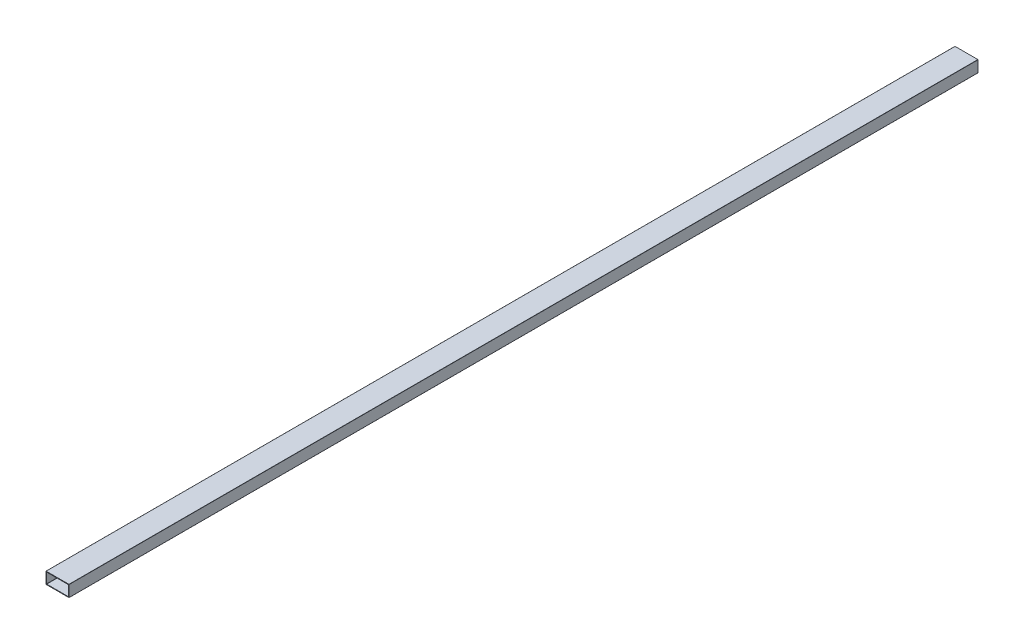
ISO-10303-21;
HEADER;
FILE_DESCRIPTION(('STEP AP214'),'2;1');
FILE_NAME('part.step','',(''),(''),'','','');
FILE_SCHEMA(('AUTOMOTIVE_DESIGN { 1 0 10303 214 1 1 1 1 }'));
ENDSEC;
DATA;
#1=APPLICATION_CONTEXT('core data for automotive mechanical design processes');
#2=APPLICATION_PROTOCOL_DEFINITION('international standard','automotive_design',2000,#1);
#3=PRODUCT_CONTEXT('',#1,'mechanical');
#4=PRODUCT('Part','Part','',(#3));
#5=PRODUCT_RELATED_PRODUCT_CATEGORY('part','',(#4));
#6=PRODUCT_DEFINITION_FORMATION('','',#4);
#7=PRODUCT_DEFINITION_CONTEXT('part definition',#1,'design');
#8=PRODUCT_DEFINITION('design','',#6,#7);
#9=PRODUCT_DEFINITION_SHAPE('','',#8);
#10=(LENGTH_UNIT() NAMED_UNIT(*) SI_UNIT(.MILLI.,.METRE.));
#11=(NAMED_UNIT(*) PLANE_ANGLE_UNIT() SI_UNIT($,.RADIAN.));
#12=(NAMED_UNIT(*) SI_UNIT($,.STERADIAN.) SOLID_ANGLE_UNIT());
#13=UNCERTAINTY_MEASURE_WITH_UNIT(LENGTH_MEASURE(1.E-05),#10,'distance_accuracy_value','');
#14=(GEOMETRIC_REPRESENTATION_CONTEXT(3) GLOBAL_UNCERTAINTY_ASSIGNED_CONTEXT((#13)) GLOBAL_UNIT_ASSIGNED_CONTEXT((#10,
#11,#12)) REPRESENTATION_CONTEXT('',''));
#15=CARTESIAN_POINT('',(0.,0.,0.));
#16=DIRECTION('',(0.,0.,1.));
#17=DIRECTION('',(1.,0.,0.));
#18=AXIS2_PLACEMENT_3D('',#15,#16,#17);
#19=CARTESIAN_POINT('',(76.2,-38.1,-6000.));
#20=DIRECTION('',(1.,0.,0.));
#21=DIRECTION('',(0.,0.,-1.));
#22=AXIS2_PLACEMENT_3D('',#19,#20,#21);
#23=PLANE('',#22);
#24=DIRECTION('',(0.,1.,0.));
#25=VECTOR('',#24,1.);
#26=CARTESIAN_POINT('',(76.2,-38.1,0.));
#27=LINE('',#26,#25);
#28=CARTESIAN_POINT('',(76.2,-37.1,0.));
#29=VERTEX_POINT('',#28);
#30=CARTESIAN_POINT('',(76.2,37.1,0.));
#31=VERTEX_POINT('',#30);
#32=EDGE_CURVE('E197',#29,#31,#27,.T.);
#33=ORIENTED_EDGE('',*,*,#32,.F.);
#34=DIRECTION('',(0.,0.,1.));
#35=VECTOR('',#34,1.);
#36=CARTESIAN_POINT('',(76.2,-37.1,-6000.));
#37=LINE('',#36,#35);
#38=CARTESIAN_POINT('',(76.2,-37.1,-6000.));
#39=VERTEX_POINT('',#38);
#40=EDGE_CURVE('E158',#29,#39,#37,.F.);
#41=ORIENTED_EDGE('',*,*,#40,.T.);
#42=DIRECTION('',(0.,1.,0.));
#43=VECTOR('',#42,1.);
#44=CARTESIAN_POINT('',(76.2,-38.1,-6000.));
#45=LINE('',#44,#43);
#46=CARTESIAN_POINT('',(76.2,37.1,-6000.));
#47=VERTEX_POINT('',#46);
#48=EDGE_CURVE('E185',#39,#47,#45,.T.);
#49=ORIENTED_EDGE('',*,*,#48,.T.);
#50=DIRECTION('',(0.,0.,1.));
#51=VECTOR('',#50,1.);
#52=CARTESIAN_POINT('',(76.2,37.1,-6000.));
#53=LINE('',#52,#51);
#54=EDGE_CURVE('E251',#47,#31,#53,.T.);
#55=ORIENTED_EDGE('',*,*,#54,.T.);
#56=EDGE_LOOP('',(#33,#41,#49,#55));
#57=FACE_BOUND('',#56,.T.);
#58=ADVANCED_FACE('F33',(#57),#23,.T.);
#59=CARTESIAN_POINT('',(-76.2,-38.1,-6000.));
#60=DIRECTION('',(0.,-1.,0.));
#61=DIRECTION('',(0.,0.,-1.));
#62=AXIS2_PLACEMENT_3D('',#59,#60,#61);
#63=PLANE('',#62);
#64=DIRECTION('',(1.,0.,0.));
#65=VECTOR('',#64,1.);
#66=CARTESIAN_POINT('',(-76.2,-38.1,0.));
#67=LINE('',#66,#65);
#68=CARTESIAN_POINT('',(-75.2,-38.1,0.));
#69=VERTEX_POINT('',#68);
#70=CARTESIAN_POINT('',(75.1999999999999,-38.1,0.));
#71=VERTEX_POINT('',#70);
#72=EDGE_CURVE('E189',#69,#71,#67,.T.);
#73=ORIENTED_EDGE('',*,*,#72,.F.);
#74=DIRECTION('',(0.,0.,1.));
#75=VECTOR('',#74,1.);
#76=CARTESIAN_POINT('',(-75.2,-38.1,-6000.));
#77=LINE('',#76,#75);
#78=CARTESIAN_POINT('',(-75.2,-38.1,-6000.));
#79=VERTEX_POINT('',#78);
#80=EDGE_CURVE('E238',#69,#79,#77,.F.);
#81=ORIENTED_EDGE('',*,*,#80,.T.);
#82=DIRECTION('',(1.,0.,0.));
#83=VECTOR('',#82,1.);
#84=CARTESIAN_POINT('',(-76.2,-38.1,-6000.));
#85=LINE('',#84,#83);
#86=CARTESIAN_POINT('',(75.1999999999999,-38.1,-6000.));
#87=VERTEX_POINT('',#86);
#88=EDGE_CURVE('E194',#79,#87,#85,.T.);
#89=ORIENTED_EDGE('',*,*,#88,.T.);
#90=DIRECTION('',(0.,0.,1.));
#91=VECTOR('',#90,1.);
#92=CARTESIAN_POINT('',(75.2,-38.1,-6000.));
#93=LINE('',#92,#91);
#94=EDGE_CURVE('E235',#87,#71,#93,.T.);
#95=ORIENTED_EDGE('',*,*,#94,.T.);
#96=EDGE_LOOP('',(#73,#81,#89,#95));
#97=FACE_BOUND('',#96,.T.);
#98=ADVANCED_FACE('F305',(#97),#63,.T.);
#99=CARTESIAN_POINT('',(-76.2,-38.1,-6000.));
#100=DIRECTION('',(-1.,0.,0.));
#101=DIRECTION('',(0.,0.,1.));
#102=AXIS2_PLACEMENT_3D('',#99,#100,#101);
#103=PLANE('',#102);
#104=DIRECTION('',(0.,-1.,0.));
#105=VECTOR('',#104,1.);
#106=CARTESIAN_POINT('',(-76.2,-38.1,-6000.));
#107=LINE('',#106,#105);
#108=CARTESIAN_POINT('',(-76.2,37.1,-6000.));
#109=VERTEX_POINT('',#108);
#110=CARTESIAN_POINT('',(-76.2,-37.1,-6000.));
#111=VERTEX_POINT('',#110);
#112=EDGE_CURVE('E191',#109,#111,#107,.T.);
#113=ORIENTED_EDGE('',*,*,#112,.T.);
#114=DIRECTION('',(0.,0.,1.));
#115=VECTOR('',#114,1.);
#116=CARTESIAN_POINT('',(-76.2,-37.1,-6000.));
#117=LINE('',#116,#115);
#118=CARTESIAN_POINT('',(-76.2,-37.1,0.));
#119=VERTEX_POINT('',#118);
#120=EDGE_CURVE('E224',#111,#119,#117,.T.);
#121=ORIENTED_EDGE('',*,*,#120,.T.);
#122=DIRECTION('',(0.,-1.,0.));
#123=VECTOR('',#122,1.);
#124=CARTESIAN_POINT('',(-76.2,-38.1,0.));
#125=LINE('',#124,#123);
#126=CARTESIAN_POINT('',(-76.2,37.1,0.));
#127=VERTEX_POINT('',#126);
#128=EDGE_CURVE('E203',#127,#119,#125,.T.);
#129=ORIENTED_EDGE('',*,*,#128,.F.);
#130=DIRECTION('',(0.,0.,1.));
#131=VECTOR('',#130,1.);
#132=CARTESIAN_POINT('',(-76.2,37.1,-6000.));
#133=LINE('',#132,#131);
#134=EDGE_CURVE('E222',#127,#109,#133,.F.);
#135=ORIENTED_EDGE('',*,*,#134,.T.);
#136=EDGE_LOOP('',(#113,#121,#129,#135));
#137=FACE_BOUND('',#136,.T.);
#138=ADVANCED_FACE('F311',(#137),#103,.T.);
#139=CARTESIAN_POINT('',(-76.2,38.1,-6000.));
#140=DIRECTION('',(0.,1.,0.));
#141=DIRECTION('',(0.,0.,1.));
#142=AXIS2_PLACEMENT_3D('',#139,#140,#141);
#143=PLANE('',#142);
#144=DIRECTION('',(-1.,0.,0.));
#145=VECTOR('',#144,1.);
#146=CARTESIAN_POINT('',(-76.2,38.1,-6000.));
#147=LINE('',#146,#145);
#148=CARTESIAN_POINT('',(75.1999999999999,38.1,-6000.));
#149=VERTEX_POINT('',#148);
#150=CARTESIAN_POINT('',(-75.2,38.1,-6000.));
#151=VERTEX_POINT('',#150);
#152=EDGE_CURVE('E188',#149,#151,#147,.T.);
#153=ORIENTED_EDGE('',*,*,#152,.T.);
#154=DIRECTION('',(0.,0.,1.));
#155=VECTOR('',#154,1.);
#156=CARTESIAN_POINT('',(-75.2,38.1,-6000.));
#157=LINE('',#156,#155);
#158=CARTESIAN_POINT('',(-75.2,38.1,0.));
#159=VERTEX_POINT('',#158);
#160=EDGE_CURVE('E248',#151,#159,#157,.T.);
#161=ORIENTED_EDGE('',*,*,#160,.T.);
#162=DIRECTION('',(-1.,0.,0.));
#163=VECTOR('',#162,1.);
#164=CARTESIAN_POINT('',(-76.2,38.1,0.));
#165=LINE('',#164,#163);
#166=CARTESIAN_POINT('',(75.1999999999999,38.1,0.));
#167=VERTEX_POINT('',#166);
#168=EDGE_CURVE('E200',#167,#159,#165,.T.);
#169=ORIENTED_EDGE('',*,*,#168,.F.);
#170=DIRECTION('',(0.,0.,1.));
#171=VECTOR('',#170,1.);
#172=CARTESIAN_POINT('',(75.2,38.1,-6000.));
#173=LINE('',#172,#171);
#174=EDGE_CURVE('E55',#167,#149,#173,.F.);
#175=ORIENTED_EDGE('',*,*,#174,.T.);
#176=EDGE_LOOP('',(#153,#161,#169,#175));
#177=FACE_BOUND('',#176,.T.);
#178=ADVANCED_FACE('F316',(#177),#143,.T.);
#179=CARTESIAN_POINT('',(0.,0.,-6000.));
#180=DIRECTION('',(0.,0.,-1.));
#181=DIRECTION('',(-1.,0.,0.));
#182=AXIS2_PLACEMENT_3D('',#179,#180,#181);
#183=PLANE('',#182);
#184=DIRECTION('',(0.,-1.,0.));
#185=VECTOR('',#184,1.);
#186=CARTESIAN_POINT('',(-72.4,-34.3,-6000.));
#187=LINE('',#186,#185);
#188=CARTESIAN_POINT('',(-72.4,33.3,-6000.));
#189=VERTEX_POINT('',#188);
#190=CARTESIAN_POINT('',(-72.4,-33.3,-6000.));
#191=VERTEX_POINT('',#190);
#192=EDGE_CURVE('E167',#189,#191,#187,.T.);
#193=ORIENTED_EDGE('',*,*,#192,.T.);
#194=CARTESIAN_POINT('',(-71.4,-33.3,-6000.));
#195=DIRECTION('',(0.,0.,-1.));
#196=DIRECTION('',(-1.,0.,0.));
#197=AXIS2_PLACEMENT_3D('',#194,#195,#196);
#198=CIRCLE('',#197,1.);
#199=CARTESIAN_POINT('',(-71.4,-34.3,-6000.));
#200=VERTEX_POINT('',#199);
#201=EDGE_CURVE('E11',#191,#200,#198,.F.);
#202=ORIENTED_EDGE('',*,*,#201,.T.);
#203=DIRECTION('',(1.,0.,0.));
#204=VECTOR('',#203,1.);
#205=CARTESIAN_POINT('',(-72.4,-34.3,-6000.));
#206=LINE('',#205,#204);
#207=CARTESIAN_POINT('',(71.3999999999999,-34.3,-6000.));
#208=VERTEX_POINT('',#207);
#209=EDGE_CURVE('E175',#200,#208,#206,.T.);
#210=ORIENTED_EDGE('',*,*,#209,.T.);
#211=CARTESIAN_POINT('',(71.4,-33.3,-6000.));
#212=DIRECTION('',(0.,0.,-1.));
#213=DIRECTION('',(-1.,0.,0.));
#214=AXIS2_PLACEMENT_3D('',#211,#212,#213);
#215=CIRCLE('',#214,1.);
#216=CARTESIAN_POINT('',(72.4,-33.3,-6000.));
#217=VERTEX_POINT('',#216);
#218=EDGE_CURVE('E262',#208,#217,#215,.F.);
#219=ORIENTED_EDGE('',*,*,#218,.T.);
#220=DIRECTION('',(0.,1.,0.));
#221=VECTOR('',#220,1.);
#222=CARTESIAN_POINT('',(72.4,-34.3,-6000.));
#223=LINE('',#222,#221);
#224=CARTESIAN_POINT('',(72.4,33.3,-6000.));
#225=VERTEX_POINT('',#224);
#226=EDGE_CURVE('E179',#217,#225,#223,.T.);
#227=ORIENTED_EDGE('',*,*,#226,.T.);
#228=CARTESIAN_POINT('',(71.4,33.3,-6000.));
#229=DIRECTION('',(0.,0.,-1.));
#230=DIRECTION('',(-1.,0.,0.));
#231=AXIS2_PLACEMENT_3D('',#228,#229,#230);
#232=CIRCLE('',#231,1.);
#233=CARTESIAN_POINT('',(71.3999999999999,34.3,-6000.));
#234=VERTEX_POINT('',#233);
#235=EDGE_CURVE('E258',#225,#234,#232,.F.);
#236=ORIENTED_EDGE('',*,*,#235,.T.);
#237=DIRECTION('',(-1.,0.,0.));
#238=VECTOR('',#237,1.);
#239=CARTESIAN_POINT('',(-72.4,34.3,-6000.));
#240=LINE('',#239,#238);
#241=CARTESIAN_POINT('',(-71.4,34.3,-6000.));
#242=VERTEX_POINT('',#241);
#243=EDGE_CURVE('E277',#234,#242,#240,.T.);
#244=ORIENTED_EDGE('',*,*,#243,.T.);
#245=CARTESIAN_POINT('',(-71.4,33.3,-6000.));
#246=DIRECTION('',(0.,0.,-1.));
#247=DIRECTION('',(-1.,0.,0.));
#248=AXIS2_PLACEMENT_3D('',#245,#246,#247);
#249=CIRCLE('',#248,1.);
#250=EDGE_CURVE('E157',#242,#189,#249,.F.);
#251=ORIENTED_EDGE('',*,*,#250,.T.);
#252=EDGE_LOOP('',(#193,#202,#210,#219,#227,#236,#244,#251));
#253=FACE_BOUND('',#252,.T.);
#254=ORIENTED_EDGE('',*,*,#88,.F.);
#255=CARTESIAN_POINT('',(-75.2,-37.1,-6000.));
#256=DIRECTION('',(0.,0.,-1.));
#257=DIRECTION('',(-1.,0.,0.));
#258=AXIS2_PLACEMENT_3D('',#255,#256,#257);
#259=CIRCLE('',#258,1.);
#260=EDGE_CURVE('E245',#79,#111,#259,.T.);
#261=ORIENTED_EDGE('',*,*,#260,.T.);
#262=ORIENTED_EDGE('',*,*,#112,.F.);
#263=CARTESIAN_POINT('',(-75.2,37.1,-6000.));
#264=DIRECTION('',(0.,0.,-1.));
#265=DIRECTION('',(-1.,0.,0.));
#266=AXIS2_PLACEMENT_3D('',#263,#264,#265);
#267=CIRCLE('',#266,1.);
#268=EDGE_CURVE('E48',#109,#151,#267,.T.);
#269=ORIENTED_EDGE('',*,*,#268,.T.);
#270=ORIENTED_EDGE('',*,*,#152,.F.);
#271=CARTESIAN_POINT('',(75.2,37.1,-6000.));
#272=DIRECTION('',(0.,0.,-1.));
#273=DIRECTION('',(-1.,0.,0.));
#274=AXIS2_PLACEMENT_3D('',#271,#272,#273);
#275=CIRCLE('',#274,1.);
#276=EDGE_CURVE('E240',#149,#47,#275,.T.);
#277=ORIENTED_EDGE('',*,*,#276,.T.);
#278=ORIENTED_EDGE('',*,*,#48,.F.);
#279=CARTESIAN_POINT('',(75.2,-37.1,-6000.));
#280=DIRECTION('',(0.,0.,-1.));
#281=DIRECTION('',(-1.,0.,0.));
#282=AXIS2_PLACEMENT_3D('',#279,#280,#281);
#283=CIRCLE('',#282,1.);
#284=EDGE_CURVE('E242',#39,#87,#283,.T.);
#285=ORIENTED_EDGE('',*,*,#284,.T.);
#286=EDGE_LOOP('',(#254,#261,#262,#269,#270,#277,#278,#285));
#287=FACE_BOUND('',#286,.T.);
#288=ADVANCED_FACE('F267',(#253,#287),#183,.T.);
#289=CARTESIAN_POINT('',(0.,0.,0.));
#290=DIRECTION('',(0.,0.,-1.));
#291=DIRECTION('',(-1.,0.,0.));
#292=AXIS2_PLACEMENT_3D('',#289,#290,#291);
#293=PLANE('',#292);
#294=DIRECTION('',(0.,1.,0.));
#295=VECTOR('',#294,1.);
#296=CARTESIAN_POINT('',(72.4,-34.3,0.));
#297=LINE('',#296,#295);
#298=CARTESIAN_POINT('',(72.4,-33.3,0.));
#299=VERTEX_POINT('',#298);
#300=CARTESIAN_POINT('',(72.4,33.3,0.));
#301=VERTEX_POINT('',#300);
#302=EDGE_CURVE('E181',#299,#301,#297,.T.);
#303=ORIENTED_EDGE('',*,*,#302,.F.);
#304=CARTESIAN_POINT('',(71.4,-33.3,0.));
#305=DIRECTION('',(0.,0.,-1.));
#306=DIRECTION('',(-1.,0.,0.));
#307=AXIS2_PLACEMENT_3D('',#304,#305,#306);
#308=CIRCLE('',#307,1.);
#309=CARTESIAN_POINT('',(71.3999999999999,-34.3,0.));
#310=VERTEX_POINT('',#309);
#311=EDGE_CURVE('E260',#299,#310,#308,.T.);
#312=ORIENTED_EDGE('',*,*,#311,.T.);
#313=DIRECTION('',(1.,0.,0.));
#314=VECTOR('',#313,1.);
#315=CARTESIAN_POINT('',(-72.4,-34.3,0.));
#316=LINE('',#315,#314);
#317=CARTESIAN_POINT('',(-71.4,-34.3,0.));
#318=VERTEX_POINT('',#317);
#319=EDGE_CURVE('E281',#318,#310,#316,.T.);
#320=ORIENTED_EDGE('',*,*,#319,.F.);
#321=CARTESIAN_POINT('',(-71.4,-33.3,0.));
#322=DIRECTION('',(0.,0.,-1.));
#323=DIRECTION('',(-1.,0.,0.));
#324=AXIS2_PLACEMENT_3D('',#321,#322,#323);
#325=CIRCLE('',#324,1.);
#326=CARTESIAN_POINT('',(-72.4,-33.3,0.));
#327=VERTEX_POINT('',#326);
#328=EDGE_CURVE('E41',#318,#327,#325,.T.);
#329=ORIENTED_EDGE('',*,*,#328,.T.);
#330=DIRECTION('',(0.,-1.,0.));
#331=VECTOR('',#330,1.);
#332=CARTESIAN_POINT('',(-72.4,-34.3,0.));
#333=LINE('',#332,#331);
#334=CARTESIAN_POINT('',(-72.4,33.3,0.));
#335=VERTEX_POINT('',#334);
#336=EDGE_CURVE('E164',#335,#327,#333,.T.);
#337=ORIENTED_EDGE('',*,*,#336,.F.);
#338=CARTESIAN_POINT('',(-71.4,33.3,0.));
#339=DIRECTION('',(0.,0.,-1.));
#340=DIRECTION('',(-1.,0.,0.));
#341=AXIS2_PLACEMENT_3D('',#338,#339,#340);
#342=CIRCLE('',#341,1.);
#343=CARTESIAN_POINT('',(-71.4,34.3,0.));
#344=VERTEX_POINT('',#343);
#345=EDGE_CURVE('E147',#335,#344,#342,.T.);
#346=ORIENTED_EDGE('',*,*,#345,.T.);
#347=DIRECTION('',(-1.,0.,0.));
#348=VECTOR('',#347,1.);
#349=CARTESIAN_POINT('',(-72.4,34.3,0.));
#350=LINE('',#349,#348);
#351=CARTESIAN_POINT('',(71.3999999999999,34.3,0.));
#352=VERTEX_POINT('',#351);
#353=EDGE_CURVE('E176',#352,#344,#350,.T.);
#354=ORIENTED_EDGE('',*,*,#353,.F.);
#355=CARTESIAN_POINT('',(71.4,33.3,0.));
#356=DIRECTION('',(0.,0.,-1.));
#357=DIRECTION('',(-1.,0.,0.));
#358=AXIS2_PLACEMENT_3D('',#355,#356,#357);
#359=CIRCLE('',#358,1.);
#360=EDGE_CURVE('E256',#352,#301,#359,.T.);
#361=ORIENTED_EDGE('',*,*,#360,.T.);
#362=EDGE_LOOP('',(#303,#312,#320,#329,#337,#346,#354,#361));
#363=FACE_BOUND('',#362,.T.);
#364=ORIENTED_EDGE('',*,*,#128,.T.);
#365=CARTESIAN_POINT('',(-75.2,-37.1,0.));
#366=DIRECTION('',(0.,0.,-1.));
#367=DIRECTION('',(-1.,0.,0.));
#368=AXIS2_PLACEMENT_3D('',#365,#366,#367);
#369=CIRCLE('',#368,1.);
#370=EDGE_CURVE('E233',#119,#69,#369,.F.);
#371=ORIENTED_EDGE('',*,*,#370,.T.);
#372=ORIENTED_EDGE('',*,*,#72,.T.);
#373=CARTESIAN_POINT('',(75.2,-37.1,0.));
#374=DIRECTION('',(0.,0.,-1.));
#375=DIRECTION('',(-1.,0.,0.));
#376=AXIS2_PLACEMENT_3D('',#373,#374,#375);
#377=CIRCLE('',#376,1.);
#378=EDGE_CURVE('E229',#71,#29,#377,.F.);
#379=ORIENTED_EDGE('',*,*,#378,.T.);
#380=ORIENTED_EDGE('',*,*,#32,.T.);
#381=CARTESIAN_POINT('',(75.2,37.1,0.));
#382=DIRECTION('',(0.,0.,-1.));
#383=DIRECTION('',(-1.,0.,0.));
#384=AXIS2_PLACEMENT_3D('',#381,#382,#383);
#385=CIRCLE('',#384,1.);
#386=EDGE_CURVE('E227',#31,#167,#385,.F.);
#387=ORIENTED_EDGE('',*,*,#386,.T.);
#388=ORIENTED_EDGE('',*,*,#168,.T.);
#389=CARTESIAN_POINT('',(-75.2,37.1,0.));
#390=DIRECTION('',(0.,0.,-1.));
#391=DIRECTION('',(-1.,0.,0.));
#392=AXIS2_PLACEMENT_3D('',#389,#390,#391);
#393=CIRCLE('',#392,1.);
#394=EDGE_CURVE('E231',#159,#127,#393,.F.);
#395=ORIENTED_EDGE('',*,*,#394,.T.);
#396=EDGE_LOOP('',(#364,#371,#372,#379,#380,#387,#388,#395));
#397=FACE_BOUND('',#396,.T.);
#398=ADVANCED_FACE('F172',(#363,#397),#293,.F.);
#399=CARTESIAN_POINT('',(-72.4,-34.3,-6000.));
#400=DIRECTION('',(0.,-1.,0.));
#401=DIRECTION('',(0.,0.,-1.));
#402=AXIS2_PLACEMENT_3D('',#399,#400,#401);
#403=PLANE('',#402);
#404=ORIENTED_EDGE('',*,*,#319,.T.);
#405=DIRECTION('',(0.,0.,1.));
#406=VECTOR('',#405,1.);
#407=CARTESIAN_POINT('',(71.4,-34.3,-6000.));
#408=LINE('',#407,#406);
#409=EDGE_CURVE('E220',#310,#208,#408,.F.);
#410=ORIENTED_EDGE('',*,*,#409,.T.);
#411=ORIENTED_EDGE('',*,*,#209,.F.);
#412=DIRECTION('',(0.,0.,1.));
#413=VECTOR('',#412,1.);
#414=CARTESIAN_POINT('',(-71.4,-34.3,0.));
#415=LINE('',#414,#413);
#416=EDGE_CURVE('E217',#200,#318,#415,.T.);
#417=ORIENTED_EDGE('',*,*,#416,.T.);
#418=EDGE_LOOP('',(#404,#410,#411,#417));
#419=FACE_BOUND('',#418,.T.);
#420=ADVANCED_FACE('F283',(#419),#403,.F.);
#421=CARTESIAN_POINT('',(-72.4,-34.3,-6000.));
#422=DIRECTION('',(-1.,0.,0.));
#423=DIRECTION('',(0.,0.,1.));
#424=AXIS2_PLACEMENT_3D('',#421,#422,#423);
#425=PLANE('',#424);
#426=ORIENTED_EDGE('',*,*,#192,.F.);
#427=DIRECTION('',(0.,0.,1.));
#428=VECTOR('',#427,1.);
#429=CARTESIAN_POINT('',(-72.4,33.3,0.));
#430=LINE('',#429,#428);
#431=EDGE_CURVE('E151',#189,#335,#430,.T.);
#432=ORIENTED_EDGE('',*,*,#431,.T.);
#433=ORIENTED_EDGE('',*,*,#336,.T.);
#434=DIRECTION('',(0.,0.,1.));
#435=VECTOR('',#434,1.);
#436=CARTESIAN_POINT('',(-72.4,-33.3,-6000.));
#437=LINE('',#436,#435);
#438=EDGE_CURVE('E169',#327,#191,#437,.F.);
#439=ORIENTED_EDGE('',*,*,#438,.T.);
#440=EDGE_LOOP('',(#426,#432,#433,#439));
#441=FACE_BOUND('',#440,.T.);
#442=ADVANCED_FACE('F163',(#441),#425,.F.);
#443=CARTESIAN_POINT('',(-72.4,34.3,-6000.));
#444=DIRECTION('',(0.,1.,0.));
#445=DIRECTION('',(0.,0.,1.));
#446=AXIS2_PLACEMENT_3D('',#443,#444,#445);
#447=PLANE('',#446);
#448=ORIENTED_EDGE('',*,*,#353,.T.);
#449=DIRECTION('',(0.,0.,1.));
#450=VECTOR('',#449,1.);
#451=CARTESIAN_POINT('',(-71.4,34.3,-6000.));
#452=LINE('',#451,#450);
#453=EDGE_CURVE('E152',#344,#242,#452,.F.);
#454=ORIENTED_EDGE('',*,*,#453,.T.);
#455=ORIENTED_EDGE('',*,*,#243,.F.);
#456=DIRECTION('',(0.,0.,1.));
#457=VECTOR('',#456,1.);
#458=CARTESIAN_POINT('',(71.4,34.3,0.));
#459=LINE('',#458,#457);
#460=EDGE_CURVE('E168',#234,#352,#459,.T.);
#461=ORIENTED_EDGE('',*,*,#460,.T.);
#462=EDGE_LOOP('',(#448,#454,#455,#461));
#463=FACE_BOUND('',#462,.T.);
#464=ADVANCED_FACE('F292',(#463),#447,.F.);
#465=CARTESIAN_POINT('',(72.4,-34.3,-6000.));
#466=DIRECTION('',(1.,0.,0.));
#467=DIRECTION('',(0.,0.,-1.));
#468=AXIS2_PLACEMENT_3D('',#465,#466,#467);
#469=PLANE('',#468);
#470=ORIENTED_EDGE('',*,*,#302,.T.);
#471=DIRECTION('',(0.,0.,1.));
#472=VECTOR('',#471,1.);
#473=CARTESIAN_POINT('',(72.4,33.3,-6000.));
#474=LINE('',#473,#472);
#475=EDGE_CURVE('E215',#301,#225,#474,.F.);
#476=ORIENTED_EDGE('',*,*,#475,.T.);
#477=ORIENTED_EDGE('',*,*,#226,.F.);
#478=DIRECTION('',(0.,0.,1.));
#479=VECTOR('',#478,1.);
#480=CARTESIAN_POINT('',(72.4,-33.3,0.));
#481=LINE('',#480,#479);
#482=EDGE_CURVE('E212',#217,#299,#481,.T.);
#483=ORIENTED_EDGE('',*,*,#482,.T.);
#484=EDGE_LOOP('',(#470,#476,#477,#483));
#485=FACE_BOUND('',#484,.T.);
#486=ADVANCED_FACE('F275',(#485),#469,.F.);
#487=CARTESIAN_POINT('',(-71.4,33.3,-6000.));
#488=DIRECTION('',(0.,0.,-1.));
#489=DIRECTION('',(-1.,0.,0.));
#490=AXIS2_PLACEMENT_3D('',#487,#488,#489);
#491=CYLINDRICAL_SURFACE('',#490,1.);
#492=ORIENTED_EDGE('',*,*,#250,.F.);
#493=ORIENTED_EDGE('',*,*,#453,.F.);
#494=ORIENTED_EDGE('',*,*,#345,.F.);
#495=ORIENTED_EDGE('',*,*,#431,.F.);
#496=EDGE_LOOP('',(#492,#493,#494,#495));
#497=FACE_BOUND('',#496,.T.);
#498=ADVANCED_FACE('F150',(#497),#491,.F.);
#499=CARTESIAN_POINT('',(71.4,33.3,-6000.));
#500=DIRECTION('',(0.,0.,-1.));
#501=DIRECTION('',(-1.,0.,0.));
#502=AXIS2_PLACEMENT_3D('',#499,#500,#501);
#503=CYLINDRICAL_SURFACE('',#502,1.);
#504=ORIENTED_EDGE('',*,*,#235,.F.);
#505=ORIENTED_EDGE('',*,*,#475,.F.);
#506=ORIENTED_EDGE('',*,*,#360,.F.);
#507=ORIENTED_EDGE('',*,*,#460,.F.);
#508=EDGE_LOOP('',(#504,#505,#506,#507));
#509=FACE_BOUND('',#508,.T.);
#510=ADVANCED_FACE('F294',(#509),#503,.F.);
#511=CARTESIAN_POINT('',(71.4,-33.3,-6000.));
#512=DIRECTION('',(0.,0.,-1.));
#513=DIRECTION('',(-1.,0.,0.));
#514=AXIS2_PLACEMENT_3D('',#511,#512,#513);
#515=CYLINDRICAL_SURFACE('',#514,1.);
#516=ORIENTED_EDGE('',*,*,#218,.F.);
#517=ORIENTED_EDGE('',*,*,#409,.F.);
#518=ORIENTED_EDGE('',*,*,#311,.F.);
#519=ORIENTED_EDGE('',*,*,#482,.F.);
#520=EDGE_LOOP('',(#516,#517,#518,#519));
#521=FACE_BOUND('',#520,.T.);
#522=ADVANCED_FACE('F279',(#521),#515,.F.);
#523=CARTESIAN_POINT('',(-75.2,-37.1,-6000.));
#524=DIRECTION('',(0.,0.,1.));
#525=DIRECTION('',(1.,0.,0.));
#526=AXIS2_PLACEMENT_3D('',#523,#524,#525);
#527=CYLINDRICAL_SURFACE('',#526,1.);
#528=ORIENTED_EDGE('',*,*,#260,.F.);
#529=ORIENTED_EDGE('',*,*,#80,.F.);
#530=ORIENTED_EDGE('',*,*,#370,.F.);
#531=ORIENTED_EDGE('',*,*,#120,.F.);
#532=EDGE_LOOP('',(#528,#529,#530,#531));
#533=FACE_BOUND('',#532,.T.);
#534=ADVANCED_FACE('F301',(#533),#527,.T.);
#535=CARTESIAN_POINT('',(-75.2,37.1,-6000.));
#536=DIRECTION('',(0.,0.,1.));
#537=DIRECTION('',(1.,0.,0.));
#538=AXIS2_PLACEMENT_3D('',#535,#536,#537);
#539=CYLINDRICAL_SURFACE('',#538,1.);
#540=ORIENTED_EDGE('',*,*,#268,.F.);
#541=ORIENTED_EDGE('',*,*,#134,.F.);
#542=ORIENTED_EDGE('',*,*,#394,.F.);
#543=ORIENTED_EDGE('',*,*,#160,.F.);
#544=EDGE_LOOP('',(#540,#541,#542,#543));
#545=FACE_BOUND('',#544,.T.);
#546=ADVANCED_FACE('F368',(#545),#539,.T.);
#547=CARTESIAN_POINT('',(-71.4,-33.3,-6000.));
#548=DIRECTION('',(0.,0.,-1.));
#549=DIRECTION('',(-1.,0.,0.));
#550=AXIS2_PLACEMENT_3D('',#547,#548,#549);
#551=CYLINDRICAL_SURFACE('',#550,1.);
#552=ORIENTED_EDGE('',*,*,#201,.F.);
#553=ORIENTED_EDGE('',*,*,#438,.F.);
#554=ORIENTED_EDGE('',*,*,#328,.F.);
#555=ORIENTED_EDGE('',*,*,#416,.F.);
#556=EDGE_LOOP('',(#552,#553,#554,#555));
#557=FACE_BOUND('',#556,.T.);
#558=ADVANCED_FACE('F378',(#557),#551,.F.);
#559=CARTESIAN_POINT('',(75.2,-37.1,-6000.));
#560=DIRECTION('',(0.,0.,1.));
#561=DIRECTION('',(1.,0.,0.));
#562=AXIS2_PLACEMENT_3D('',#559,#560,#561);
#563=CYLINDRICAL_SURFACE('',#562,1.);
#564=ORIENTED_EDGE('',*,*,#284,.F.);
#565=ORIENTED_EDGE('',*,*,#40,.F.);
#566=ORIENTED_EDGE('',*,*,#378,.F.);
#567=ORIENTED_EDGE('',*,*,#94,.F.);
#568=EDGE_LOOP('',(#564,#565,#566,#567));
#569=FACE_BOUND('',#568,.T.);
#570=ADVANCED_FACE('F388',(#569),#563,.T.);
#571=CARTESIAN_POINT('',(75.2,37.1,-6000.));
#572=DIRECTION('',(0.,0.,1.));
#573=DIRECTION('',(1.,0.,0.));
#574=AXIS2_PLACEMENT_3D('',#571,#572,#573);
#575=CYLINDRICAL_SURFACE('',#574,1.);
#576=ORIENTED_EDGE('',*,*,#276,.F.);
#577=ORIENTED_EDGE('',*,*,#174,.F.);
#578=ORIENTED_EDGE('',*,*,#386,.F.);
#579=ORIENTED_EDGE('',*,*,#54,.F.);
#580=EDGE_LOOP('',(#576,#577,#578,#579));
#581=FACE_BOUND('',#580,.T.);
#582=ADVANCED_FACE('F35',(#581),#575,.T.);
#583=CLOSED_SHELL('',(#58,#98,#138,#178,#288,#398,#420,#442,#464,#486,#498,#510,#522,#534,#546,
#558,#570,#582));
#584=MANIFOLD_SOLID_BREP('B2',#583);
#585=ADVANCED_BREP_SHAPE_REPRESENTATION('',(#18,#584),#14);
#586=SHAPE_DEFINITION_REPRESENTATION(#9,#585);
ENDSEC;
END-ISO-10303-21;
